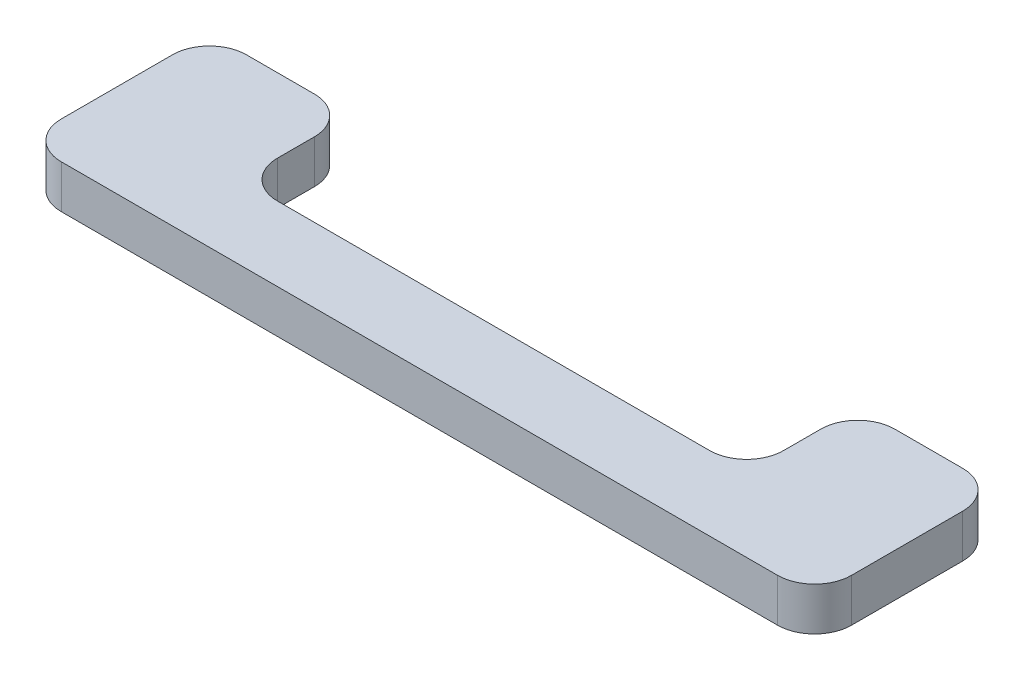
ISO-10303-21;
HEADER;
FILE_DESCRIPTION(('STEP AP214'),'2;1');
FILE_NAME('part.step','',(''),(''),'','','');
FILE_SCHEMA(('AUTOMOTIVE_DESIGN { 1 0 10303 214 1 1 1 1 }'));
ENDSEC;
DATA;
#1=APPLICATION_CONTEXT('core data for automotive mechanical design processes');
#2=APPLICATION_PROTOCOL_DEFINITION('international standard','automotive_design',2000,#1);
#3=PRODUCT_CONTEXT('',#1,'mechanical');
#4=PRODUCT('Part','Part','',(#3));
#5=PRODUCT_RELATED_PRODUCT_CATEGORY('part','',(#4));
#6=PRODUCT_DEFINITION_FORMATION('','',#4);
#7=PRODUCT_DEFINITION_CONTEXT('part definition',#1,'design');
#8=PRODUCT_DEFINITION('design','',#6,#7);
#9=PRODUCT_DEFINITION_SHAPE('','',#8);
#10=(LENGTH_UNIT() NAMED_UNIT(*) SI_UNIT(.MILLI.,.METRE.));
#11=(NAMED_UNIT(*) PLANE_ANGLE_UNIT() SI_UNIT($,.RADIAN.));
#12=(NAMED_UNIT(*) SI_UNIT($,.STERADIAN.) SOLID_ANGLE_UNIT());
#13=UNCERTAINTY_MEASURE_WITH_UNIT(LENGTH_MEASURE(1.E-05),#10,'distance_accuracy_value','');
#14=(GEOMETRIC_REPRESENTATION_CONTEXT(3) GLOBAL_UNCERTAINTY_ASSIGNED_CONTEXT((#13)) GLOBAL_UNIT_ASSIGNED_CONTEXT((#10,
#11,#12)) REPRESENTATION_CONTEXT('',''));
#15=CARTESIAN_POINT('',(0.,0.,0.));
#16=DIRECTION('',(0.,0.,1.));
#17=DIRECTION('',(1.,0.,0.));
#18=AXIS2_PLACEMENT_3D('',#15,#16,#17);
#19=CARTESIAN_POINT('',(-205.,35.,0.));
#20=DIRECTION('',(-1.,0.,0.));
#21=DIRECTION('',(0.,0.,1.));
#22=AXIS2_PLACEMENT_3D('',#19,#20,#21);
#23=PLANE('',#22);
#24=DIRECTION('',(0.,0.,-1.));
#25=VECTOR('',#24,1.);
#26=CARTESIAN_POINT('',(-205.,35.,0.));
#27=LINE('',#26,#25);
#28=CARTESIAN_POINT('',(-205.,35.,-29.9999999999999));
#29=VERTEX_POINT('',#28);
#30=CARTESIAN_POINT('',(-205.,35.,-59.9999999999999));
#31=VERTEX_POINT('',#30);
#32=EDGE_CURVE('E188',#29,#31,#27,.T.);
#33=ORIENTED_EDGE('',*,*,#32,.F.);
#34=DIRECTION('',(0.,-1.,0.));
#35=VECTOR('',#34,1.);
#36=CARTESIAN_POINT('',(-205.,0.,-30.));
#37=LINE('',#36,#35);
#38=CARTESIAN_POINT('',(-205.,0.,-29.9999999999999));
#39=VERTEX_POINT('',#38);
#40=EDGE_CURVE('E230',#29,#39,#37,.T.);
#41=ORIENTED_EDGE('',*,*,#40,.T.);
#42=DIRECTION('',(0.,0.,-1.));
#43=VECTOR('',#42,1.);
#44=CARTESIAN_POINT('',(-205.,0.,0.));
#45=LINE('',#44,#43);
#46=CARTESIAN_POINT('',(-205.,0.,-59.9999999999999));
#47=VERTEX_POINT('',#46);
#48=EDGE_CURVE('E248',#39,#47,#45,.T.);
#49=ORIENTED_EDGE('',*,*,#48,.T.);
#50=DIRECTION('',(0.,-1.,0.));
#51=VECTOR('',#50,1.);
#52=CARTESIAN_POINT('',(-205.,35.,-60.));
#53=LINE('',#52,#51);
#54=EDGE_CURVE('E228',#47,#31,#53,.F.);
#55=ORIENTED_EDGE('',*,*,#54,.T.);
#56=EDGE_LOOP('',(#33,#41,#49,#55));
#57=FACE_BOUND('',#56,.T.);
#58=ADVANCED_FACE('F34',(#57),#23,.F.);
#59=CARTESIAN_POINT('',(-205.,35.,-90.));
#60=DIRECTION('',(0.,0.,1.));
#61=DIRECTION('',(1.,0.,0.));
#62=AXIS2_PLACEMENT_3D('',#59,#60,#61);
#63=PLANE('',#62);
#64=DIRECTION('',(-1.,0.,0.));
#65=VECTOR('',#64,1.);
#66=CARTESIAN_POINT('',(-205.,0.,-90.));
#67=LINE('',#66,#65);
#68=CARTESIAN_POINT('',(-235.,0.,-90.));
#69=VERTEX_POINT('',#68);
#70=CARTESIAN_POINT('',(-290.,0.,-89.9999999999999));
#71=VERTEX_POINT('',#70);
#72=EDGE_CURVE('E280',#69,#71,#67,.T.);
#73=ORIENTED_EDGE('',*,*,#72,.T.);
#74=DIRECTION('',(0.,-1.,0.));
#75=VECTOR('',#74,1.);
#76=CARTESIAN_POINT('',(-290.,35.,-89.9999999999999));
#77=LINE('',#76,#75);
#78=CARTESIAN_POINT('',(-290.,35.,-89.9999999999999));
#79=VERTEX_POINT('',#78);
#80=EDGE_CURVE('E241',#71,#79,#77,.F.);
#81=ORIENTED_EDGE('',*,*,#80,.T.);
#82=DIRECTION('',(-1.,0.,0.));
#83=VECTOR('',#82,1.);
#84=CARTESIAN_POINT('',(-205.,35.,-90.));
#85=LINE('',#84,#83);
#86=CARTESIAN_POINT('',(-235.,35.,-90.));
#87=VERTEX_POINT('',#86);
#88=EDGE_CURVE('E262',#87,#79,#85,.T.);
#89=ORIENTED_EDGE('',*,*,#88,.F.);
#90=DIRECTION('',(0.,-1.,0.));
#91=VECTOR('',#90,1.);
#92=CARTESIAN_POINT('',(-235.,35.,-90.));
#93=LINE('',#92,#91);
#94=EDGE_CURVE('E238',#87,#69,#93,.T.);
#95=ORIENTED_EDGE('',*,*,#94,.T.);
#96=EDGE_LOOP('',(#73,#81,#89,#95));
#97=FACE_BOUND('',#96,.T.);
#98=ADVANCED_FACE('F304',(#97),#63,.F.);
#99=CARTESIAN_POINT('',(-320.,35.,-89.9999999999999));
#100=DIRECTION('',(1.,0.,0.));
#101=DIRECTION('',(0.,0.,-1.));
#102=AXIS2_PLACEMENT_3D('',#99,#100,#101);
#103=PLANE('',#102);
#104=DIRECTION('',(0.,0.,1.));
#105=VECTOR('',#104,1.);
#106=CARTESIAN_POINT('',(-320.,0.,-89.9999999999999));
#107=LINE('',#106,#105);
#108=CARTESIAN_POINT('',(-320.,0.,-59.9999999999999));
#109=VERTEX_POINT('',#108);
#110=CARTESIAN_POINT('',(-320.,0.,30.0000000000001));
#111=VERTEX_POINT('',#110);
#112=EDGE_CURVE('E180',#109,#111,#107,.T.);
#113=ORIENTED_EDGE('',*,*,#112,.T.);
#114=DIRECTION('',(0.,-1.,0.));
#115=VECTOR('',#114,1.);
#116=CARTESIAN_POINT('',(-320.,35.,30.0000000000001));
#117=LINE('',#116,#115);
#118=CARTESIAN_POINT('',(-320.,35.,30.0000000000001));
#119=VERTEX_POINT('',#118);
#120=EDGE_CURVE('E236',#111,#119,#117,.F.);
#121=ORIENTED_EDGE('',*,*,#120,.T.);
#122=DIRECTION('',(0.,0.,1.));
#123=VECTOR('',#122,1.);
#124=CARTESIAN_POINT('',(-320.,35.,-89.9999999999999));
#125=LINE('',#124,#123);
#126=CARTESIAN_POINT('',(-320.,35.,-59.9999999999999));
#127=VERTEX_POINT('',#126);
#128=EDGE_CURVE('E265',#127,#119,#125,.T.);
#129=ORIENTED_EDGE('',*,*,#128,.F.);
#130=DIRECTION('',(0.,-1.,0.));
#131=VECTOR('',#130,1.);
#132=CARTESIAN_POINT('',(-320.,35.,-59.9999999999999));
#133=LINE('',#132,#131);
#134=EDGE_CURVE('E233',#127,#109,#133,.T.);
#135=ORIENTED_EDGE('',*,*,#134,.T.);
#136=EDGE_LOOP('',(#113,#121,#129,#135));
#137=FACE_BOUND('',#136,.T.);
#138=ADVANCED_FACE('F286',(#137),#103,.F.);
#139=CARTESIAN_POINT('',(-320.,35.,60.));
#140=DIRECTION('',(0.,0.,-1.));
#141=DIRECTION('',(-1.,0.,0.));
#142=AXIS2_PLACEMENT_3D('',#139,#140,#141);
#143=PLANE('',#142);
#144=DIRECTION('',(1.,0.,0.));
#145=VECTOR('',#144,1.);
#146=CARTESIAN_POINT('',(-320.,0.,60.));
#147=LINE('',#146,#145);
#148=CARTESIAN_POINT('',(-290.,0.,60.));
#149=VERTEX_POINT('',#148);
#150=CARTESIAN_POINT('',(290.,0.,60.));
#151=VERTEX_POINT('',#150);
#152=EDGE_CURVE('E175',#149,#151,#147,.T.);
#153=ORIENTED_EDGE('',*,*,#152,.T.);
#154=DIRECTION('',(0.,-1.,0.));
#155=VECTOR('',#154,1.);
#156=CARTESIAN_POINT('',(290.,35.,60.));
#157=LINE('',#156,#155);
#158=CARTESIAN_POINT('',(290.,35.,60.));
#159=VERTEX_POINT('',#158);
#160=EDGE_CURVE('E153',#151,#159,#157,.F.);
#161=ORIENTED_EDGE('',*,*,#160,.T.);
#162=DIRECTION('',(1.,0.,0.));
#163=VECTOR('',#162,1.);
#164=CARTESIAN_POINT('',(-320.,35.,60.));
#165=LINE('',#164,#163);
#166=CARTESIAN_POINT('',(-290.,35.,60.));
#167=VERTEX_POINT('',#166);
#168=EDGE_CURVE('E270',#167,#159,#165,.T.);
#169=ORIENTED_EDGE('',*,*,#168,.F.);
#170=DIRECTION('',(0.,-1.,0.));
#171=VECTOR('',#170,1.);
#172=CARTESIAN_POINT('',(-290.,35.,60.));
#173=LINE('',#172,#171);
#174=EDGE_CURVE('E158',#167,#149,#173,.T.);
#175=ORIENTED_EDGE('',*,*,#174,.T.);
#176=EDGE_LOOP('',(#153,#161,#169,#175));
#177=FACE_BOUND('',#176,.T.);
#178=ADVANCED_FACE('F295',(#177),#143,.F.);
#179=CARTESIAN_POINT('',(320.,35.,-89.9999999999999));
#180=DIRECTION('',(-1.,0.,0.));
#181=DIRECTION('',(0.,0.,1.));
#182=AXIS2_PLACEMENT_3D('',#179,#180,#181);
#183=PLANE('',#182);
#184=DIRECTION('',(0.,0.,-1.));
#185=VECTOR('',#184,1.);
#186=CARTESIAN_POINT('',(320.,35.,-89.9999999999999));
#187=LINE('',#186,#185);
#188=CARTESIAN_POINT('',(320.,35.,30.0000000000001));
#189=VERTEX_POINT('',#188);
#190=CARTESIAN_POINT('',(320.,35.,-59.9999999999999));
#191=VERTEX_POINT('',#190);
#192=EDGE_CURVE('E168',#189,#191,#187,.T.);
#193=ORIENTED_EDGE('',*,*,#192,.F.);
#194=DIRECTION('',(0.,-1.,0.));
#195=VECTOR('',#194,1.);
#196=CARTESIAN_POINT('',(320.,35.,30.0000000000001));
#197=LINE('',#196,#195);
#198=CARTESIAN_POINT('',(320.,0.,30.0000000000001));
#199=VERTEX_POINT('',#198);
#200=EDGE_CURVE('E152',#189,#199,#197,.T.);
#201=ORIENTED_EDGE('',*,*,#200,.T.);
#202=DIRECTION('',(0.,0.,-1.));
#203=VECTOR('',#202,1.);
#204=CARTESIAN_POINT('',(320.,0.,-89.9999999999999));
#205=LINE('',#204,#203);
#206=CARTESIAN_POINT('',(320.,0.,-59.9999999999999));
#207=VERTEX_POINT('',#206);
#208=EDGE_CURVE('E165',#199,#207,#205,.T.);
#209=ORIENTED_EDGE('',*,*,#208,.T.);
#210=DIRECTION('',(0.,-1.,0.));
#211=VECTOR('',#210,1.);
#212=CARTESIAN_POINT('',(320.,35.,-59.9999999999999));
#213=LINE('',#212,#211);
#214=EDGE_CURVE('E170',#207,#191,#213,.F.);
#215=ORIENTED_EDGE('',*,*,#214,.T.);
#216=EDGE_LOOP('',(#193,#201,#209,#215));
#217=FACE_BOUND('',#216,.T.);
#218=ADVANCED_FACE('F164',(#217),#183,.F.);
#219=CARTESIAN_POINT('',(205.,35.,-90.));
#220=DIRECTION('',(0.,0.,1.));
#221=DIRECTION('',(1.,0.,0.));
#222=AXIS2_PLACEMENT_3D('',#219,#220,#221);
#223=PLANE('',#222);
#224=DIRECTION('',(-1.,0.,0.));
#225=VECTOR('',#224,1.);
#226=CARTESIAN_POINT('',(205.,35.,-90.));
#227=LINE('',#226,#225);
#228=CARTESIAN_POINT('',(290.,35.,-89.9999999999999));
#229=VERTEX_POINT('',#228);
#230=CARTESIAN_POINT('',(235.,35.,-90.));
#231=VERTEX_POINT('',#230);
#232=EDGE_CURVE('E273',#229,#231,#227,.T.);
#233=ORIENTED_EDGE('',*,*,#232,.F.);
#234=DIRECTION('',(0.,-1.,0.));
#235=VECTOR('',#234,1.);
#236=CARTESIAN_POINT('',(290.,35.,-89.9999999999999));
#237=LINE('',#236,#235);
#238=CARTESIAN_POINT('',(290.,0.,-89.9999999999999));
#239=VERTEX_POINT('',#238);
#240=EDGE_CURVE('E216',#229,#239,#237,.T.);
#241=ORIENTED_EDGE('',*,*,#240,.T.);
#242=DIRECTION('',(-1.,0.,0.));
#243=VECTOR('',#242,1.);
#244=CARTESIAN_POINT('',(205.,0.,-90.));
#245=LINE('',#244,#243);
#246=CARTESIAN_POINT('',(235.,0.,-90.));
#247=VERTEX_POINT('',#246);
#248=EDGE_CURVE('E174',#239,#247,#245,.T.);
#249=ORIENTED_EDGE('',*,*,#248,.T.);
#250=DIRECTION('',(0.,-1.,0.));
#251=VECTOR('',#250,1.);
#252=CARTESIAN_POINT('',(235.,35.,-90.));
#253=LINE('',#252,#251);
#254=EDGE_CURVE('E214',#247,#231,#253,.F.);
#255=ORIENTED_EDGE('',*,*,#254,.T.);
#256=EDGE_LOOP('',(#233,#241,#249,#255));
#257=FACE_BOUND('',#256,.T.);
#258=ADVANCED_FACE('F302',(#257),#223,.F.);
#259=CARTESIAN_POINT('',(205.,35.,0.));
#260=DIRECTION('',(1.,0.,0.));
#261=DIRECTION('',(0.,0.,-1.));
#262=AXIS2_PLACEMENT_3D('',#259,#260,#261);
#263=PLANE('',#262);
#264=DIRECTION('',(0.,0.,1.));
#265=VECTOR('',#264,1.);
#266=CARTESIAN_POINT('',(205.,35.,0.));
#267=LINE('',#266,#265);
#268=CARTESIAN_POINT('',(205.,35.,-59.9999999999999));
#269=VERTEX_POINT('',#268);
#270=CARTESIAN_POINT('',(205.,35.,-29.9999999999999));
#271=VERTEX_POINT('',#270);
#272=EDGE_CURVE('E276',#269,#271,#267,.T.);
#273=ORIENTED_EDGE('',*,*,#272,.F.);
#274=DIRECTION('',(0.,-1.,0.));
#275=VECTOR('',#274,1.);
#276=CARTESIAN_POINT('',(205.,35.,-60.));
#277=LINE('',#276,#275);
#278=CARTESIAN_POINT('',(205.,0.,-59.9999999999999));
#279=VERTEX_POINT('',#278);
#280=EDGE_CURVE('E221',#269,#279,#277,.T.);
#281=ORIENTED_EDGE('',*,*,#280,.T.);
#282=DIRECTION('',(0.,0.,1.));
#283=VECTOR('',#282,1.);
#284=CARTESIAN_POINT('',(205.,0.,0.));
#285=LINE('',#284,#283);
#286=CARTESIAN_POINT('',(205.,0.,-29.9999999999999));
#287=VERTEX_POINT('',#286);
#288=EDGE_CURVE('E178',#279,#287,#285,.T.);
#289=ORIENTED_EDGE('',*,*,#288,.T.);
#290=DIRECTION('',(0.,-1.,0.));
#291=VECTOR('',#290,1.);
#292=CARTESIAN_POINT('',(205.,35.,-30.));
#293=LINE('',#292,#291);
#294=EDGE_CURVE('E219',#287,#271,#293,.F.);
#295=ORIENTED_EDGE('',*,*,#294,.T.);
#296=EDGE_LOOP('',(#273,#281,#289,#295));
#297=FACE_BOUND('',#296,.T.);
#298=ADVANCED_FACE('F410',(#297),#263,.F.);
#299=CARTESIAN_POINT('',(205.,35.,0.));
#300=DIRECTION('',(0.,0.,1.));
#301=DIRECTION('',(1.,0.,0.));
#302=AXIS2_PLACEMENT_3D('',#299,#300,#301);
#303=PLANE('',#302);
#304=DIRECTION('',(-1.,0.,0.));
#305=VECTOR('',#304,1.);
#306=CARTESIAN_POINT('',(205.,35.,0.));
#307=LINE('',#306,#305);
#308=CARTESIAN_POINT('',(175.,35.,0.));
#309=VERTEX_POINT('',#308);
#310=CARTESIAN_POINT('',(-175.,35.,0.));
#311=VERTEX_POINT('',#310);
#312=EDGE_CURVE('E189',#309,#311,#307,.T.);
#313=ORIENTED_EDGE('',*,*,#312,.F.);
#314=DIRECTION('',(0.,-1.,0.));
#315=VECTOR('',#314,1.);
#316=CARTESIAN_POINT('',(175.,0.,0.));
#317=LINE('',#316,#315);
#318=CARTESIAN_POINT('',(175.,0.,0.));
#319=VERTEX_POINT('',#318);
#320=EDGE_CURVE('E225',#309,#319,#317,.T.);
#321=ORIENTED_EDGE('',*,*,#320,.T.);
#322=DIRECTION('',(-1.,0.,0.));
#323=VECTOR('',#322,1.);
#324=CARTESIAN_POINT('',(205.,0.,0.));
#325=LINE('',#324,#323);
#326=CARTESIAN_POINT('',(-175.,0.,0.));
#327=VERTEX_POINT('',#326);
#328=EDGE_CURVE('E186',#319,#327,#325,.T.);
#329=ORIENTED_EDGE('',*,*,#328,.T.);
#330=DIRECTION('',(0.,-1.,0.));
#331=VECTOR('',#330,1.);
#332=CARTESIAN_POINT('',(-175.,35.,0.));
#333=LINE('',#332,#331);
#334=EDGE_CURVE('E49',#327,#311,#333,.F.);
#335=ORIENTED_EDGE('',*,*,#334,.T.);
#336=EDGE_LOOP('',(#313,#321,#329,#335));
#337=FACE_BOUND('',#336,.T.);
#338=ADVANCED_FACE('F251',(#337),#303,.F.);
#339=CARTESIAN_POINT('',(0.,35.,0.));
#340=DIRECTION('',(0.,1.,0.));
#341=DIRECTION('',(0.,0.,1.));
#342=AXIS2_PLACEMENT_3D('',#339,#340,#341);
#343=PLANE('',#342);
#344=ORIENTED_EDGE('',*,*,#168,.T.);
#345=CARTESIAN_POINT('',(290.,35.,30.));
#346=DIRECTION('',(0.,1.,0.));
#347=DIRECTION('',(0.,0.,1.));
#348=AXIS2_PLACEMENT_3D('',#345,#346,#347);
#349=CIRCLE('',#348,30.);
#350=EDGE_CURVE('E212',#159,#189,#349,.T.);
#351=ORIENTED_EDGE('',*,*,#350,.T.);
#352=ORIENTED_EDGE('',*,*,#192,.T.);
#353=CARTESIAN_POINT('',(290.,35.,-60.));
#354=DIRECTION('',(0.,1.,0.));
#355=DIRECTION('',(0.,0.,1.));
#356=AXIS2_PLACEMENT_3D('',#353,#354,#355);
#357=CIRCLE('',#356,30.);
#358=EDGE_CURVE('E210',#191,#229,#357,.T.);
#359=ORIENTED_EDGE('',*,*,#358,.T.);
#360=ORIENTED_EDGE('',*,*,#232,.T.);
#361=CARTESIAN_POINT('',(235.,35.,-60.));
#362=DIRECTION('',(0.,1.,0.));
#363=DIRECTION('',(0.,0.,1.));
#364=AXIS2_PLACEMENT_3D('',#361,#362,#363);
#365=CIRCLE('',#364,30.);
#366=EDGE_CURVE('E208',#231,#269,#365,.T.);
#367=ORIENTED_EDGE('',*,*,#366,.T.);
#368=ORIENTED_EDGE('',*,*,#272,.T.);
#369=CARTESIAN_POINT('',(175.,35.,-30.));
#370=DIRECTION('',(0.,1.,0.));
#371=DIRECTION('',(0.,0.,1.));
#372=AXIS2_PLACEMENT_3D('',#369,#370,#371);
#373=CIRCLE('',#372,30.);
#374=EDGE_CURVE('E56',#271,#309,#373,.F.);
#375=ORIENTED_EDGE('',*,*,#374,.T.);
#376=ORIENTED_EDGE('',*,*,#312,.T.);
#377=CARTESIAN_POINT('',(-175.,35.,-30.));
#378=DIRECTION('',(0.,1.,0.));
#379=DIRECTION('',(0.,0.,1.));
#380=AXIS2_PLACEMENT_3D('',#377,#378,#379);
#381=CIRCLE('',#380,30.);
#382=EDGE_CURVE('E11',#311,#29,#381,.F.);
#383=ORIENTED_EDGE('',*,*,#382,.T.);
#384=ORIENTED_EDGE('',*,*,#32,.T.);
#385=CARTESIAN_POINT('',(-235.,35.,-60.));
#386=DIRECTION('',(0.,1.,0.));
#387=DIRECTION('',(0.,0.,1.));
#388=AXIS2_PLACEMENT_3D('',#385,#386,#387);
#389=CIRCLE('',#388,30.);
#390=EDGE_CURVE('E202',#31,#87,#389,.T.);
#391=ORIENTED_EDGE('',*,*,#390,.T.);
#392=ORIENTED_EDGE('',*,*,#88,.T.);
#393=CARTESIAN_POINT('',(-290.,35.,-59.9999999999999));
#394=DIRECTION('',(0.,1.,0.));
#395=DIRECTION('',(0.,0.,1.));
#396=AXIS2_PLACEMENT_3D('',#393,#394,#395);
#397=CIRCLE('',#396,30.);
#398=EDGE_CURVE('E204',#79,#127,#397,.T.);
#399=ORIENTED_EDGE('',*,*,#398,.T.);
#400=ORIENTED_EDGE('',*,*,#128,.T.);
#401=CARTESIAN_POINT('',(-290.,35.,30.));
#402=DIRECTION('',(0.,1.,0.));
#403=DIRECTION('',(0.,0.,1.));
#404=AXIS2_PLACEMENT_3D('',#401,#402,#403);
#405=CIRCLE('',#404,30.);
#406=EDGE_CURVE('E206',#119,#167,#405,.T.);
#407=ORIENTED_EDGE('',*,*,#406,.T.);
#408=EDGE_LOOP('',(#344,#351,#352,#359,#360,#367,#368,#375,#376,#383,#384,#391,#392,#399,#400,#407));
#409=FACE_BOUND('',#408,.T.);
#410=ADVANCED_FACE('F258',(#409),#343,.T.);
#411=CARTESIAN_POINT('',(0.,0.,0.));
#412=DIRECTION('',(0.,1.,0.));
#413=DIRECTION('',(0.,0.,1.));
#414=AXIS2_PLACEMENT_3D('',#411,#412,#413);
#415=PLANE('',#414);
#416=ORIENTED_EDGE('',*,*,#208,.F.);
#417=CARTESIAN_POINT('',(290.,0.,30.));
#418=DIRECTION('',(0.,1.,0.));
#419=DIRECTION('',(0.,0.,1.));
#420=AXIS2_PLACEMENT_3D('',#417,#418,#419);
#421=CIRCLE('',#420,30.);
#422=EDGE_CURVE('E148',#199,#151,#421,.F.);
#423=ORIENTED_EDGE('',*,*,#422,.T.);
#424=ORIENTED_EDGE('',*,*,#152,.F.);
#425=CARTESIAN_POINT('',(-290.,0.,30.));
#426=DIRECTION('',(0.,1.,0.));
#427=DIRECTION('',(0.,0.,1.));
#428=AXIS2_PLACEMENT_3D('',#425,#426,#427);
#429=CIRCLE('',#428,30.);
#430=EDGE_CURVE('E194',#149,#111,#429,.F.);
#431=ORIENTED_EDGE('',*,*,#430,.T.);
#432=ORIENTED_EDGE('',*,*,#112,.F.);
#433=CARTESIAN_POINT('',(-290.,0.,-59.9999999999999));
#434=DIRECTION('',(0.,1.,0.));
#435=DIRECTION('',(0.,0.,1.));
#436=AXIS2_PLACEMENT_3D('',#433,#434,#435);
#437=CIRCLE('',#436,30.);
#438=EDGE_CURVE('E192',#109,#71,#437,.F.);
#439=ORIENTED_EDGE('',*,*,#438,.T.);
#440=ORIENTED_EDGE('',*,*,#72,.F.);
#441=CARTESIAN_POINT('',(-235.,0.,-60.));
#442=DIRECTION('',(0.,1.,0.));
#443=DIRECTION('',(0.,0.,1.));
#444=AXIS2_PLACEMENT_3D('',#441,#442,#443);
#445=CIRCLE('',#444,30.);
#446=EDGE_CURVE('E169',#69,#47,#445,.F.);
#447=ORIENTED_EDGE('',*,*,#446,.T.);
#448=ORIENTED_EDGE('',*,*,#48,.F.);
#449=CARTESIAN_POINT('',(-175.,0.,-30.));
#450=DIRECTION('',(0.,1.,0.));
#451=DIRECTION('',(0.,0.,1.));
#452=AXIS2_PLACEMENT_3D('',#449,#450,#451);
#453=CIRCLE('',#452,30.);
#454=EDGE_CURVE('E42',#39,#327,#453,.T.);
#455=ORIENTED_EDGE('',*,*,#454,.T.);
#456=ORIENTED_EDGE('',*,*,#328,.F.);
#457=CARTESIAN_POINT('',(175.,0.,-30.));
#458=DIRECTION('',(0.,1.,0.));
#459=DIRECTION('',(0.,0.,1.));
#460=AXIS2_PLACEMENT_3D('',#457,#458,#459);
#461=CIRCLE('',#460,30.);
#462=EDGE_CURVE('E243',#319,#287,#461,.T.);
#463=ORIENTED_EDGE('',*,*,#462,.T.);
#464=ORIENTED_EDGE('',*,*,#288,.F.);
#465=CARTESIAN_POINT('',(235.,0.,-60.));
#466=DIRECTION('',(0.,1.,0.));
#467=DIRECTION('',(0.,0.,1.));
#468=AXIS2_PLACEMENT_3D('',#465,#466,#467);
#469=CIRCLE('',#468,30.);
#470=EDGE_CURVE('E196',#279,#247,#469,.F.);
#471=ORIENTED_EDGE('',*,*,#470,.T.);
#472=ORIENTED_EDGE('',*,*,#248,.F.);
#473=CARTESIAN_POINT('',(290.,0.,-60.));
#474=DIRECTION('',(0.,1.,0.));
#475=DIRECTION('',(0.,0.,1.));
#476=AXIS2_PLACEMENT_3D('',#473,#474,#475);
#477=CIRCLE('',#476,30.);
#478=EDGE_CURVE('E159',#239,#207,#477,.F.);
#479=ORIENTED_EDGE('',*,*,#478,.T.);
#480=EDGE_LOOP('',(#416,#423,#424,#431,#432,#439,#440,#447,#448,#455,#456,#463,#464,#471,#472,#479));
#481=FACE_BOUND('',#480,.T.);
#482=ADVANCED_FACE('F172',(#481),#415,.F.);
#483=CARTESIAN_POINT('',(290.,35.,30.));
#484=DIRECTION('',(0.,-1.,0.));
#485=DIRECTION('',(0.,0.,-1.));
#486=AXIS2_PLACEMENT_3D('',#483,#484,#485);
#487=CYLINDRICAL_SURFACE('',#486,30.);
#488=ORIENTED_EDGE('',*,*,#350,.F.);
#489=ORIENTED_EDGE('',*,*,#160,.F.);
#490=ORIENTED_EDGE('',*,*,#422,.F.);
#491=ORIENTED_EDGE('',*,*,#200,.F.);
#492=EDGE_LOOP('',(#488,#489,#490,#491));
#493=FACE_BOUND('',#492,.T.);
#494=ADVANCED_FACE('F151',(#493),#487,.T.);
#495=CARTESIAN_POINT('',(290.,35.,-60.));
#496=DIRECTION('',(0.,-1.,0.));
#497=DIRECTION('',(0.,0.,-1.));
#498=AXIS2_PLACEMENT_3D('',#495,#496,#497);
#499=CYLINDRICAL_SURFACE('',#498,30.);
#500=ORIENTED_EDGE('',*,*,#358,.F.);
#501=ORIENTED_EDGE('',*,*,#214,.F.);
#502=ORIENTED_EDGE('',*,*,#478,.F.);
#503=ORIENTED_EDGE('',*,*,#240,.F.);
#504=EDGE_LOOP('',(#500,#501,#502,#503));
#505=FACE_BOUND('',#504,.T.);
#506=ADVANCED_FACE('F316',(#505),#499,.T.);
#507=CARTESIAN_POINT('',(235.,35.,-60.));
#508=DIRECTION('',(0.,-1.,0.));
#509=DIRECTION('',(0.,0.,-1.));
#510=AXIS2_PLACEMENT_3D('',#507,#508,#509);
#511=CYLINDRICAL_SURFACE('',#510,30.);
#512=ORIENTED_EDGE('',*,*,#366,.F.);
#513=ORIENTED_EDGE('',*,*,#254,.F.);
#514=ORIENTED_EDGE('',*,*,#470,.F.);
#515=ORIENTED_EDGE('',*,*,#280,.F.);
#516=EDGE_LOOP('',(#512,#513,#514,#515));
#517=FACE_BOUND('',#516,.T.);
#518=ADVANCED_FACE('F319',(#517),#511,.T.);
#519=CARTESIAN_POINT('',(175.,35.,-30.));
#520=DIRECTION('',(0.,1.,0.));
#521=DIRECTION('',(0.,0.,1.));
#522=AXIS2_PLACEMENT_3D('',#519,#520,#521);
#523=CYLINDRICAL_SURFACE('',#522,30.);
#524=ORIENTED_EDGE('',*,*,#374,.F.);
#525=ORIENTED_EDGE('',*,*,#294,.F.);
#526=ORIENTED_EDGE('',*,*,#462,.F.);
#527=ORIENTED_EDGE('',*,*,#320,.F.);
#528=EDGE_LOOP('',(#524,#525,#526,#527));
#529=FACE_BOUND('',#528,.T.);
#530=ADVANCED_FACE('F323',(#529),#523,.F.);
#531=CARTESIAN_POINT('',(-175.,35.,-30.));
#532=DIRECTION('',(0.,1.,0.));
#533=DIRECTION('',(0.,0.,1.));
#534=AXIS2_PLACEMENT_3D('',#531,#532,#533);
#535=CYLINDRICAL_SURFACE('',#534,30.);
#536=ORIENTED_EDGE('',*,*,#382,.F.);
#537=ORIENTED_EDGE('',*,*,#334,.F.);
#538=ORIENTED_EDGE('',*,*,#454,.F.);
#539=ORIENTED_EDGE('',*,*,#40,.F.);
#540=EDGE_LOOP('',(#536,#537,#538,#539));
#541=FACE_BOUND('',#540,.T.);
#542=ADVANCED_FACE('F254',(#541),#535,.F.);
#543=CARTESIAN_POINT('',(-290.,35.,30.));
#544=DIRECTION('',(0.,-1.,0.));
#545=DIRECTION('',(0.,0.,-1.));
#546=AXIS2_PLACEMENT_3D('',#543,#544,#545);
#547=CYLINDRICAL_SURFACE('',#546,30.);
#548=ORIENTED_EDGE('',*,*,#406,.F.);
#549=ORIENTED_EDGE('',*,*,#120,.F.);
#550=ORIENTED_EDGE('',*,*,#430,.F.);
#551=ORIENTED_EDGE('',*,*,#174,.F.);
#552=EDGE_LOOP('',(#548,#549,#550,#551));
#553=FACE_BOUND('',#552,.T.);
#554=ADVANCED_FACE('F291',(#553),#547,.T.);
#555=CARTESIAN_POINT('',(-290.,35.,-59.9999999999999));
#556=DIRECTION('',(0.,-1.,0.));
#557=DIRECTION('',(0.,0.,-1.));
#558=AXIS2_PLACEMENT_3D('',#555,#556,#557);
#559=CYLINDRICAL_SURFACE('',#558,30.);
#560=ORIENTED_EDGE('',*,*,#398,.F.);
#561=ORIENTED_EDGE('',*,*,#80,.F.);
#562=ORIENTED_EDGE('',*,*,#438,.F.);
#563=ORIENTED_EDGE('',*,*,#134,.F.);
#564=EDGE_LOOP('',(#560,#561,#562,#563));
#565=FACE_BOUND('',#564,.T.);
#566=ADVANCED_FACE('F331',(#565),#559,.T.);
#567=CARTESIAN_POINT('',(-235.,35.,-60.));
#568=DIRECTION('',(0.,-1.,0.));
#569=DIRECTION('',(0.,0.,-1.));
#570=AXIS2_PLACEMENT_3D('',#567,#568,#569);
#571=CYLINDRICAL_SURFACE('',#570,30.);
#572=ORIENTED_EDGE('',*,*,#390,.F.);
#573=ORIENTED_EDGE('',*,*,#54,.F.);
#574=ORIENTED_EDGE('',*,*,#446,.F.);
#575=ORIENTED_EDGE('',*,*,#94,.F.);
#576=EDGE_LOOP('',(#572,#573,#574,#575));
#577=FACE_BOUND('',#576,.T.);
#578=ADVANCED_FACE('F36',(#577),#571,.T.);
#579=CLOSED_SHELL('',(#58,#98,#138,#178,#218,#258,#298,#338,#410,#482,#494,#506,#518,#530,#542,
#554,#566,#578));
#580=MANIFOLD_SOLID_BREP('B2',#579);
#581=ADVANCED_BREP_SHAPE_REPRESENTATION('',(#18,#580),#14);
#582=SHAPE_DEFINITION_REPRESENTATION(#9,#581);
ENDSEC;
END-ISO-10303-21;
